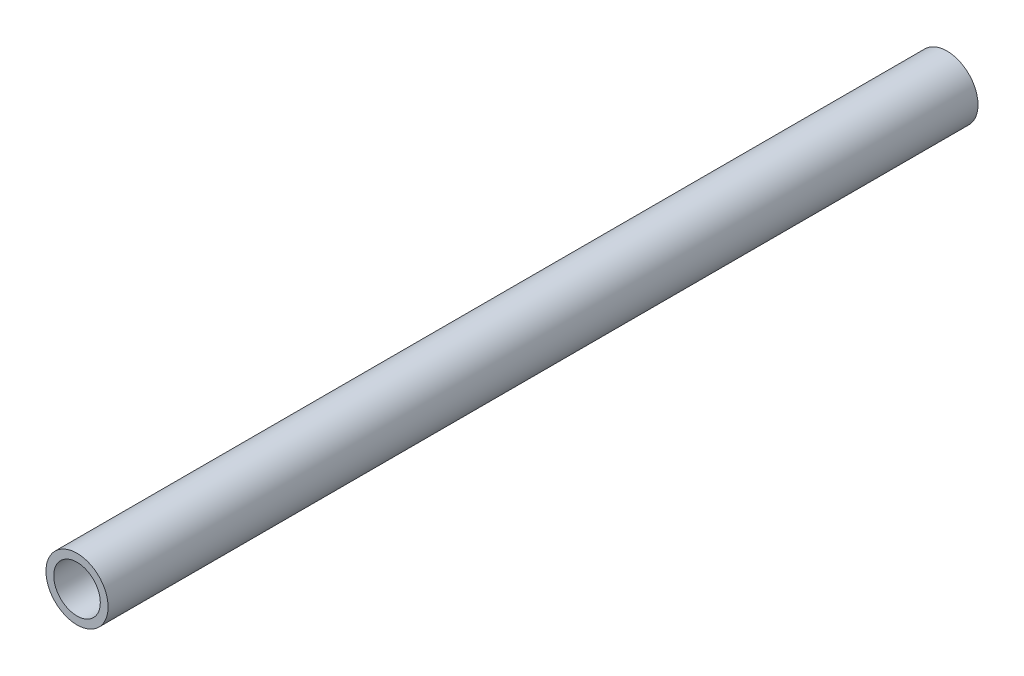
ISO-10303-21;
HEADER;
FILE_DESCRIPTION(('STEP AP214'),'2;1');
FILE_NAME('part.step','',(''),(''),'','','');
FILE_SCHEMA(('AUTOMOTIVE_DESIGN { 1 0 10303 214 1 1 1 1 }'));
ENDSEC;
DATA;
#1=APPLICATION_CONTEXT('core data for automotive mechanical design processes');
#2=APPLICATION_PROTOCOL_DEFINITION('international standard','automotive_design',2000,#1);
#3=PRODUCT_CONTEXT('',#1,'mechanical');
#4=PRODUCT('Part','Part','',(#3));
#5=PRODUCT_RELATED_PRODUCT_CATEGORY('part','',(#4));
#6=PRODUCT_DEFINITION_FORMATION('','',#4);
#7=PRODUCT_DEFINITION_CONTEXT('part definition',#1,'design');
#8=PRODUCT_DEFINITION('design','',#6,#7);
#9=PRODUCT_DEFINITION_SHAPE('','',#8);
#10=(LENGTH_UNIT() NAMED_UNIT(*) SI_UNIT(.MILLI.,.METRE.));
#11=(NAMED_UNIT(*) PLANE_ANGLE_UNIT() SI_UNIT($,.RADIAN.));
#12=(NAMED_UNIT(*) SI_UNIT($,.STERADIAN.) SOLID_ANGLE_UNIT());
#13=UNCERTAINTY_MEASURE_WITH_UNIT(LENGTH_MEASURE(1.E-05),#10,'distance_accuracy_value','');
#14=(GEOMETRIC_REPRESENTATION_CONTEXT(3) GLOBAL_UNCERTAINTY_ASSIGNED_CONTEXT((#13)) GLOBAL_UNIT_ASSIGNED_CONTEXT((#10,
#11,#12)) REPRESENTATION_CONTEXT('',''));
#15=CARTESIAN_POINT('',(0.,0.,0.));
#16=DIRECTION('',(0.,0.,1.));
#17=DIRECTION('',(1.,0.,0.));
#18=AXIS2_PLACEMENT_3D('',#15,#16,#17);
#19=CARTESIAN_POINT('',(0.,0.,-355.6));
#20=DIRECTION('',(0.,0.,1.));
#21=DIRECTION('',(1.,0.,0.));
#22=AXIS2_PLACEMENT_3D('',#19,#20,#21);
#23=CYLINDRICAL_SURFACE('',#22,12.7);
#24=CARTESIAN_POINT('',(0.,0.,-355.6));
#25=DIRECTION('',(0.,0.,1.));
#26=DIRECTION('',(1.,0.,0.));
#27=AXIS2_PLACEMENT_3D('',#24,#25,#26);
#28=CIRCLE('',#27,12.7);
#29=CARTESIAN_POINT('',(12.7,0.,-355.6));
#30=VERTEX_POINT('',#29);
#31=EDGE_CURVE('E10',#30,#30,#28,.T.);
#32=ORIENTED_EDGE('',*,*,#31,.T.);
#33=EDGE_LOOP('',(#32));
#34=FACE_BOUND('',#33,.T.);
#35=CARTESIAN_POINT('',(0.,0.,0.));
#36=DIRECTION('',(0.,0.,1.));
#37=DIRECTION('',(1.,0.,0.));
#38=AXIS2_PLACEMENT_3D('',#35,#36,#37);
#39=CIRCLE('',#38,12.7);
#40=CARTESIAN_POINT('',(12.7,0.,0.));
#41=VERTEX_POINT('',#40);
#42=EDGE_CURVE('E34',#41,#41,#39,.T.);
#43=ORIENTED_EDGE('',*,*,#42,.F.);
#44=EDGE_LOOP('',(#43));
#45=FACE_BOUND('',#44,.T.);
#46=ADVANCED_FACE('F31',(#34,#45),#23,.T.);
#47=CARTESIAN_POINT('',(0.,0.,-355.6));
#48=DIRECTION('',(0.,0.,1.));
#49=DIRECTION('',(1.,0.,0.));
#50=AXIS2_PLACEMENT_3D('',#47,#48,#49);
#51=PLANE('',#50);
#52=CARTESIAN_POINT('',(0.,0.,-355.6));
#53=DIRECTION('',(0.,0.,1.));
#54=DIRECTION('',(1.,0.,0.));
#55=AXIS2_PLACEMENT_3D('',#52,#53,#54);
#56=CIRCLE('',#55,9.525);
#57=CARTESIAN_POINT('',(9.525,0.,-355.6));
#58=VERTEX_POINT('',#57);
#59=EDGE_CURVE('E41',#58,#58,#56,.T.);
#60=ORIENTED_EDGE('',*,*,#59,.T.);
#61=EDGE_LOOP('',(#60));
#62=FACE_BOUND('',#61,.T.);
#63=ORIENTED_EDGE('',*,*,#31,.F.);
#64=EDGE_LOOP('',(#63));
#65=FACE_BOUND('',#64,.T.);
#66=ADVANCED_FACE('F49',(#62,#65),#51,.F.);
#67=CARTESIAN_POINT('',(0.,0.,0.));
#68=DIRECTION('',(0.,0.,1.));
#69=DIRECTION('',(1.,0.,0.));
#70=AXIS2_PLACEMENT_3D('',#67,#68,#69);
#71=PLANE('',#70);
#72=CARTESIAN_POINT('',(0.,0.,0.));
#73=DIRECTION('',(0.,0.,1.));
#74=DIRECTION('',(1.,0.,0.));
#75=AXIS2_PLACEMENT_3D('',#72,#73,#74);
#76=CIRCLE('',#75,9.525);
#77=CARTESIAN_POINT('',(9.525,0.,0.));
#78=VERTEX_POINT('',#77);
#79=EDGE_CURVE('E43',#78,#78,#76,.T.);
#80=ORIENTED_EDGE('',*,*,#79,.F.);
#81=EDGE_LOOP('',(#80));
#82=FACE_BOUND('',#81,.T.);
#83=ORIENTED_EDGE('',*,*,#42,.T.);
#84=EDGE_LOOP('',(#83));
#85=FACE_BOUND('',#84,.T.);
#86=ADVANCED_FACE('F55',(#82,#85),#71,.T.);
#87=CARTESIAN_POINT('',(0.,0.,-355.6));
#88=DIRECTION('',(0.,0.,1.));
#89=DIRECTION('',(1.,0.,0.));
#90=AXIS2_PLACEMENT_3D('',#87,#88,#89);
#91=CYLINDRICAL_SURFACE('',#90,9.525);
#92=ORIENTED_EDGE('',*,*,#59,.F.);
#93=EDGE_LOOP('',(#92));
#94=FACE_BOUND('',#93,.T.);
#95=ORIENTED_EDGE('',*,*,#79,.T.);
#96=EDGE_LOOP('',(#95));
#97=FACE_BOUND('',#96,.T.);
#98=ADVANCED_FACE('F52',(#94,#97),#91,.F.);
#99=CLOSED_SHELL('',(#46,#66,#86,#98));
#100=MANIFOLD_SOLID_BREP('B2',#99);
#101=ADVANCED_BREP_SHAPE_REPRESENTATION('',(#18,#100),#14);
#102=SHAPE_DEFINITION_REPRESENTATION(#9,#101);
ENDSEC;
END-ISO-10303-21;
